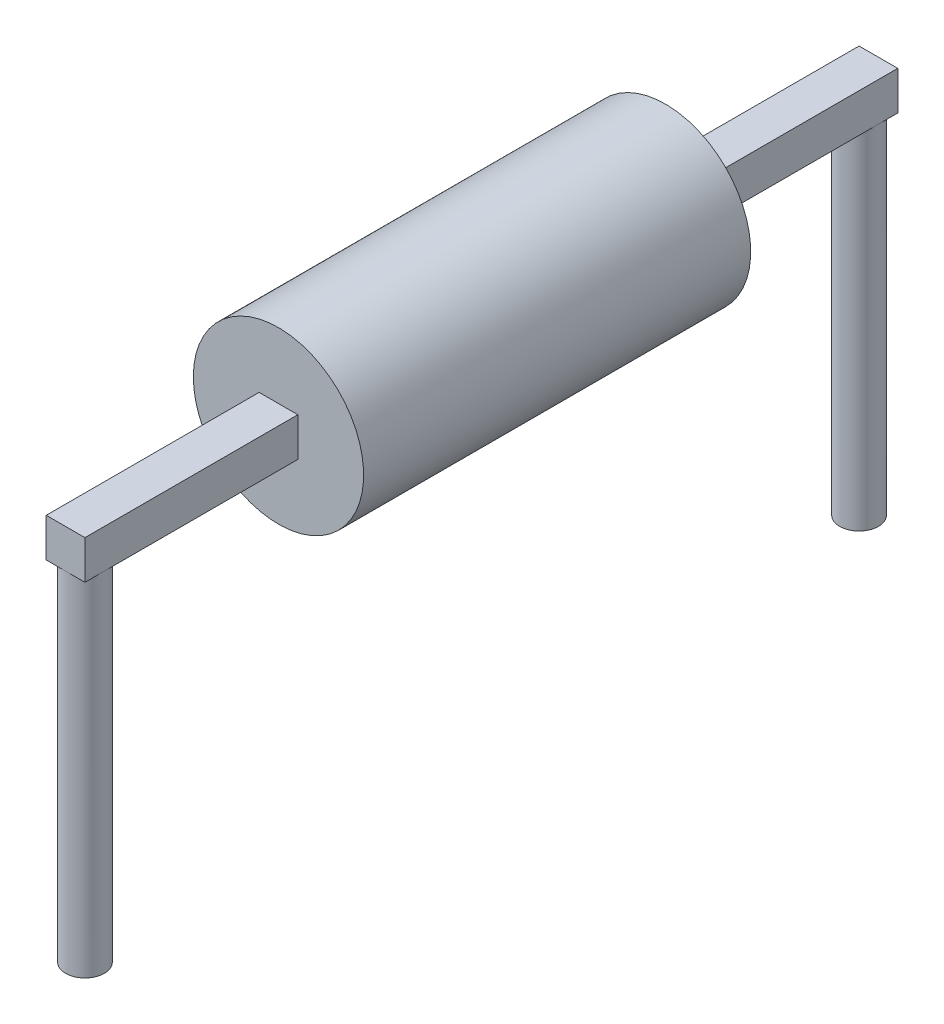
ISO-10303-21;
HEADER;
FILE_DESCRIPTION(('STEP AP214'),'2;1');
FILE_NAME('part.step','',(''),(''),'','','');
FILE_SCHEMA(('AUTOMOTIVE_DESIGN { 1 0 10303 214 1 1 1 1 }'));
ENDSEC;
DATA;
#1=APPLICATION_CONTEXT('core data for automotive mechanical design processes');
#2=APPLICATION_PROTOCOL_DEFINITION('international standard','automotive_design',2000,#1);
#3=PRODUCT_CONTEXT('',#1,'mechanical');
#4=PRODUCT('Part','Part','',(#3));
#5=PRODUCT_RELATED_PRODUCT_CATEGORY('part','',(#4));
#6=PRODUCT_DEFINITION_FORMATION('','',#4);
#7=PRODUCT_DEFINITION_CONTEXT('part definition',#1,'design');
#8=PRODUCT_DEFINITION('design','',#6,#7);
#9=PRODUCT_DEFINITION_SHAPE('','',#8);
#10=(LENGTH_UNIT() NAMED_UNIT(*) SI_UNIT(.MILLI.,.METRE.));
#11=(NAMED_UNIT(*) PLANE_ANGLE_UNIT() SI_UNIT($,.RADIAN.));
#12=(NAMED_UNIT(*) SI_UNIT($,.STERADIAN.) SOLID_ANGLE_UNIT());
#13=UNCERTAINTY_MEASURE_WITH_UNIT(LENGTH_MEASURE(1.E-05),#10,'distance_accuracy_value','');
#14=(GEOMETRIC_REPRESENTATION_CONTEXT(3) GLOBAL_UNCERTAINTY_ASSIGNED_CONTEXT((#13)) GLOBAL_UNIT_ASSIGNED_CONTEXT((#10,
#11,#12)) REPRESENTATION_CONTEXT('',''));
#15=CARTESIAN_POINT('',(0.,0.,0.));
#16=DIRECTION('',(0.,0.,1.));
#17=DIRECTION('',(1.,0.,0.));
#18=AXIS2_PLACEMENT_3D('',#15,#16,#17);
#19=CARTESIAN_POINT('',(-0.250117438522129,-0.25,7.74999999999998));
#20=DIRECTION('',(0.,1.,0.));
#21=DIRECTION('',(-0.999999999999999,0.,0.));
#22=AXIS2_PLACEMENT_3D('',#19,#20,#21);
#23=PLANE('',#22);
#24=CARTESIAN_POINT('',(0.,-0.25,-2.5));
#25=DIRECTION('',(0.,1.,0.));
#26=DIRECTION('',(-0.999999999999999,0.,0.));
#27=AXIS2_PLACEMENT_3D('',#24,#25,#26);
#28=CIRCLE('',#27,0.25);
#29=CARTESIAN_POINT('',(0.,-0.25,-2.75));
#30=VERTEX_POINT('',#29);
#31=CARTESIAN_POINT('',(0.249882561477871,-0.25,-2.50766194944277));
#32=VERTEX_POINT('',#31);
#33=EDGE_CURVE('E11',#30,#32,#28,.F.);
#34=ORIENTED_EDGE('',*,*,#33,.F.);
#35=DIRECTION('',(0.999999999999999,0.,0.));
#36=VECTOR('',#35,1.);
#37=CARTESIAN_POINT('',(-0.250117438522129,-0.25,-2.75));
#38=LINE('',#37,#36);
#39=CARTESIAN_POINT('',(0.249882561477871,-0.25,-2.75));
#40=VERTEX_POINT('',#39);
#41=EDGE_CURVE('E122',#30,#40,#38,.T.);
#42=ORIENTED_EDGE('',*,*,#41,.T.);
#43=DIRECTION('',(0.,0.,-0.999999999999999));
#44=VECTOR('',#43,1.);
#45=CARTESIAN_POINT('',(0.249882561477871,-0.25,7.74999999999998));
#46=LINE('',#45,#44);
#47=EDGE_CURVE('E32',#32,#40,#46,.T.);
#48=ORIENTED_EDGE('',*,*,#47,.F.);
#49=EDGE_LOOP('',(#34,#42,#48));
#50=FACE_BOUND('',#49,.T.);
#51=ADVANCED_FACE('F28',(#50),#23,.F.);
#52=CARTESIAN_POINT('',(0.,-0.25,-2.5));
#53=DIRECTION('',(0.,-1.,0.));
#54=DIRECTION('',(0.999999999999999,0.,0.));
#55=AXIS2_PLACEMENT_3D('',#52,#53,#54);
#56=CIRCLE('',#55,0.25);
#57=CARTESIAN_POINT('',(0.249882561477871,-0.25,-2.49233805055721));
#58=VERTEX_POINT('',#57);
#59=EDGE_CURVE('E52',#58,#30,#56,.T.);
#60=ORIENTED_EDGE('',*,*,#59,.F.);
#61=CARTESIAN_POINT('',(0.249882561477871,-0.25,0.));
#62=VERTEX_POINT('',#61);
#63=EDGE_CURVE('E218',#62,#58,#46,.T.);
#64=ORIENTED_EDGE('',*,*,#63,.F.);
#65=DIRECTION('',(-0.999999999999999,0.,0.));
#66=VECTOR('',#65,1.);
#67=CARTESIAN_POINT('',(0.,-0.25,0.));
#68=LINE('',#67,#66);
#69=CARTESIAN_POINT('',(-0.250117438522129,-0.25,0.));
#70=VERTEX_POINT('',#69);
#71=EDGE_CURVE('E230',#62,#70,#68,.T.);
#72=ORIENTED_EDGE('',*,*,#71,.T.);
#73=DIRECTION('',(0.,0.,-0.999999999999999));
#74=VECTOR('',#73,1.);
#75=CARTESIAN_POINT('',(-0.250117438522129,-0.25,7.74999999999998));
#76=LINE('',#75,#74);
#77=CARTESIAN_POINT('',(-0.250117438522129,-0.25,-2.75));
#78=VERTEX_POINT('',#77);
#79=EDGE_CURVE('E117',#70,#78,#76,.T.);
#80=ORIENTED_EDGE('',*,*,#79,.T.);
#81=EDGE_CURVE('E112',#78,#30,#38,.T.);
#82=ORIENTED_EDGE('',*,*,#81,.T.);
#83=EDGE_LOOP('',(#60,#64,#72,#80,#82));
#84=FACE_BOUND('',#83,.T.);
#85=ADVANCED_FACE('F114',(#84),#23,.F.);
#86=CARTESIAN_POINT('',(0.,-0.25,7.49999999999998));
#87=DIRECTION('',(0.,-1.,0.));
#88=DIRECTION('',(0.999999999999999,0.,0.));
#89=AXIS2_PLACEMENT_3D('',#86,#87,#88);
#90=CIRCLE('',#89,0.25);
#91=CARTESIAN_POINT('',(0.249882561477871,-0.25,7.50766194944277));
#92=VERTEX_POINT('',#91);
#93=CARTESIAN_POINT('',(0.,-0.25,7.74999999999998));
#94=VERTEX_POINT('',#93);
#95=EDGE_CURVE('E440',#92,#94,#90,.T.);
#96=ORIENTED_EDGE('',*,*,#95,.F.);
#97=CARTESIAN_POINT('',(0.249882561477871,-0.25,7.74999999999998));
#98=VERTEX_POINT('',#97);
#99=EDGE_CURVE('E211',#98,#92,#46,.T.);
#100=ORIENTED_EDGE('',*,*,#99,.F.);
#101=DIRECTION('',(0.999999999999999,0.,0.));
#102=VECTOR('',#101,1.);
#103=CARTESIAN_POINT('',(-0.250117438522129,-0.25,7.74999999999998));
#104=LINE('',#103,#102);
#105=EDGE_CURVE('E190',#94,#98,#104,.T.);
#106=ORIENTED_EDGE('',*,*,#105,.F.);
#107=EDGE_LOOP('',(#96,#100,#106));
#108=FACE_BOUND('',#107,.T.);
#109=ADVANCED_FACE('F290',(#108),#23,.F.);
#110=CARTESIAN_POINT('',(0.249882561477871,-0.25,7.49233805055721));
#111=VERTEX_POINT('',#110);
#112=EDGE_CURVE('E137',#94,#111,#90,.T.);
#113=ORIENTED_EDGE('',*,*,#112,.F.);
#114=CARTESIAN_POINT('',(-0.250117438522129,-0.25,7.74999999999998));
#115=VERTEX_POINT('',#114);
#116=EDGE_CURVE('E191',#115,#94,#104,.T.);
#117=ORIENTED_EDGE('',*,*,#116,.F.);
#118=CARTESIAN_POINT('',(-0.250117438522129,-0.25,5.));
#119=VERTEX_POINT('',#118);
#120=EDGE_CURVE('E206',#115,#119,#76,.T.);
#121=ORIENTED_EDGE('',*,*,#120,.T.);
#122=DIRECTION('',(-0.999999999999999,0.,0.));
#123=VECTOR('',#122,1.);
#124=CARTESIAN_POINT('',(0.,-0.25,5.));
#125=LINE('',#124,#123);
#126=CARTESIAN_POINT('',(0.249882561477871,-0.25,5.));
#127=VERTEX_POINT('',#126);
#128=EDGE_CURVE('E256',#127,#119,#125,.T.);
#129=ORIENTED_EDGE('',*,*,#128,.F.);
#130=EDGE_CURVE('E215',#111,#127,#46,.T.);
#131=ORIENTED_EDGE('',*,*,#130,.F.);
#132=EDGE_LOOP('',(#113,#117,#121,#129,#131));
#133=FACE_BOUND('',#132,.T.);
#134=ADVANCED_FACE('F257',(#133),#23,.F.);
#135=CARTESIAN_POINT('',(0.,0.,5.));
#136=DIRECTION('',(0.,0.,0.999999999999999));
#137=DIRECTION('',(0.999999999999999,0.,0.));
#138=AXIS2_PLACEMENT_3D('',#135,#136,#137);
#139=PLANE('',#138);
#140=CARTESIAN_POINT('',(0.,0.,5.));
#141=DIRECTION('',(0.,0.,0.999999999999999));
#142=DIRECTION('',(0.999999999999999,0.,0.));
#143=AXIS2_PLACEMENT_3D('',#140,#141,#142);
#144=CIRCLE('',#143,1.1);
#145=CARTESIAN_POINT('',(-1.1,0.,5.));
#146=VERTEX_POINT('',#145);
#147=EDGE_CURVE('E270',#146,#146,#144,.T.);
#148=ORIENTED_EDGE('',*,*,#147,.T.);
#149=EDGE_LOOP('',(#148));
#150=FACE_BOUND('',#149,.T.);
#151=ORIENTED_EDGE('',*,*,#128,.T.);
#152=DIRECTION('',(0.,1.,0.));
#153=VECTOR('',#152,1.);
#154=CARTESIAN_POINT('',(-0.250117438522129,0.,5.));
#155=LINE('',#154,#153);
#156=CARTESIAN_POINT('',(-0.250117438522129,0.249999999999999,5.));
#157=VERTEX_POINT('',#156);
#158=EDGE_CURVE('E261',#119,#157,#155,.T.);
#159=ORIENTED_EDGE('',*,*,#158,.T.);
#160=DIRECTION('',(0.999999999999999,0.,0.));
#161=VECTOR('',#160,1.);
#162=CARTESIAN_POINT('',(0.,0.250000000000001,5.));
#163=LINE('',#162,#161);
#164=CARTESIAN_POINT('',(0.249882561477871,0.250000000000001,5.));
#165=VERTEX_POINT('',#164);
#166=EDGE_CURVE('E238',#157,#165,#163,.T.);
#167=ORIENTED_EDGE('',*,*,#166,.T.);
#168=DIRECTION('',(0.,-1.,0.));
#169=VECTOR('',#168,1.);
#170=CARTESIAN_POINT('',(0.249882561477871,0.,5.));
#171=LINE('',#170,#169);
#172=EDGE_CURVE('E250',#165,#127,#171,.T.);
#173=ORIENTED_EDGE('',*,*,#172,.T.);
#174=EDGE_LOOP('',(#151,#159,#167,#173));
#175=FACE_BOUND('',#174,.T.);
#176=ADVANCED_FACE('F263',(#150,#175),#139,.T.);
#177=CARTESIAN_POINT('',(0.,0.,0.));
#178=DIRECTION('',(0.,0.,0.999999999999999));
#179=DIRECTION('',(0.999999999999999,0.,0.));
#180=AXIS2_PLACEMENT_3D('',#177,#178,#179);
#181=PLANE('',#180);
#182=CARTESIAN_POINT('',(0.,0.,0.));
#183=DIRECTION('',(0.,0.,0.999999999999999));
#184=DIRECTION('',(0.999999999999999,0.,0.));
#185=AXIS2_PLACEMENT_3D('',#182,#183,#184);
#186=CIRCLE('',#185,1.1);
#187=CARTESIAN_POINT('',(-1.1,0.,0.));
#188=VERTEX_POINT('',#187);
#189=EDGE_CURVE('E267',#188,#188,#186,.T.);
#190=ORIENTED_EDGE('',*,*,#189,.F.);
#191=EDGE_LOOP('',(#190));
#192=FACE_BOUND('',#191,.T.);
#193=DIRECTION('',(0.,1.,0.));
#194=VECTOR('',#193,1.);
#195=CARTESIAN_POINT('',(-0.250117438522129,0.,0.));
#196=LINE('',#195,#194);
#197=CARTESIAN_POINT('',(-0.250117438522129,0.250000000000001,0.));
#198=VERTEX_POINT('',#197);
#199=EDGE_CURVE('E38',#70,#198,#196,.T.);
#200=ORIENTED_EDGE('',*,*,#199,.F.);
#201=ORIENTED_EDGE('',*,*,#71,.F.);
#202=DIRECTION('',(0.,-1.,0.));
#203=VECTOR('',#202,1.);
#204=CARTESIAN_POINT('',(0.249882561477871,0.,0.));
#205=LINE('',#204,#203);
#206=CARTESIAN_POINT('',(0.249882561477871,0.250000000000001,0.));
#207=VERTEX_POINT('',#206);
#208=EDGE_CURVE('E229',#207,#62,#205,.T.);
#209=ORIENTED_EDGE('',*,*,#208,.F.);
#210=DIRECTION('',(0.999999999999999,0.,0.));
#211=VECTOR('',#210,1.);
#212=CARTESIAN_POINT('',(0.,0.250000000000001,0.));
#213=LINE('',#212,#211);
#214=EDGE_CURVE('E273',#198,#207,#213,.T.);
#215=ORIENTED_EDGE('',*,*,#214,.F.);
#216=EDGE_LOOP('',(#200,#201,#209,#215));
#217=FACE_BOUND('',#216,.T.);
#218=ADVANCED_FACE('F298',(#192,#217),#181,.F.);
#219=CARTESIAN_POINT('',(0.,0.,5.));
#220=DIRECTION('',(0.,0.,-0.999999999999999));
#221=DIRECTION('',(-0.999999999999999,0.,0.));
#222=AXIS2_PLACEMENT_3D('',#219,#220,#221);
#223=CYLINDRICAL_SURFACE('',#222,1.1);
#224=CARTESIAN_POINT('',(-1.1,0.,5.));
#225=CARTESIAN_POINT('',(-1.1,0.,4.94791666666667));
#226=CARTESIAN_POINT('',(-1.1,0.,4.89583333333334));
#227=CARTESIAN_POINT('',(-1.1,0.,4.79166666666667));
#228=CARTESIAN_POINT('',(-1.1,0.,4.73958333333334));
#229=CARTESIAN_POINT('',(-1.1,0.,4.63541666666667));
#230=CARTESIAN_POINT('',(-1.1,0.,4.58333333333334));
#231=CARTESIAN_POINT('',(-1.1,0.,4.47916666666667));
#232=CARTESIAN_POINT('',(-1.1,0.,4.42708333333334));
#233=CARTESIAN_POINT('',(-1.1,0.,4.32291666666667));
#234=CARTESIAN_POINT('',(-1.1,0.,4.27083333333334));
#235=CARTESIAN_POINT('',(-1.1,0.,4.16666666666667));
#236=CARTESIAN_POINT('',(-1.1,0.,4.11458333333334));
#237=CARTESIAN_POINT('',(-1.1,0.,4.01041666666667));
#238=CARTESIAN_POINT('',(-1.1,0.,3.95833333333334));
#239=CARTESIAN_POINT('',(-1.1,0.,3.85416666666667));
#240=CARTESIAN_POINT('',(-1.1,0.,3.80208333333334));
#241=CARTESIAN_POINT('',(-1.1,0.,3.69791666666667));
#242=CARTESIAN_POINT('',(-1.1,0.,3.64583333333334));
#243=CARTESIAN_POINT('',(-1.1,0.,3.54166666666667));
#244=CARTESIAN_POINT('',(-1.1,0.,3.48958333333334));
#245=CARTESIAN_POINT('',(-1.1,0.,3.38541666666667));
#246=CARTESIAN_POINT('',(-1.1,0.,3.33333333333334));
#247=CARTESIAN_POINT('',(-1.1,0.,3.22916666666667));
#248=CARTESIAN_POINT('',(-1.1,0.,3.17708333333334));
#249=CARTESIAN_POINT('',(-1.1,0.,3.07291666666667));
#250=CARTESIAN_POINT('',(-1.1,0.,3.02083333333334));
#251=CARTESIAN_POINT('',(-1.1,0.,2.91666666666667));
#252=CARTESIAN_POINT('',(-1.1,0.,2.86458333333334));
#253=CARTESIAN_POINT('',(-1.1,0.,2.76041666666667));
#254=CARTESIAN_POINT('',(-1.1,0.,2.70833333333334));
#255=CARTESIAN_POINT('',(-1.1,0.,2.60416666666667));
#256=CARTESIAN_POINT('',(-1.1,0.,2.55208333333333));
#257=CARTESIAN_POINT('',(-1.1,0.,2.44791666666667));
#258=CARTESIAN_POINT('',(-1.1,0.,2.39583333333334));
#259=CARTESIAN_POINT('',(-1.1,0.,2.29166666666667));
#260=CARTESIAN_POINT('',(-1.1,0.,2.23958333333334));
#261=CARTESIAN_POINT('',(-1.1,0.,2.13541666666667));
#262=CARTESIAN_POINT('',(-1.1,0.,2.08333333333334));
#263=CARTESIAN_POINT('',(-1.1,0.,1.97916666666667));
#264=CARTESIAN_POINT('',(-1.1,0.,1.92708333333333));
#265=CARTESIAN_POINT('',(-1.1,0.,1.82291666666667));
#266=CARTESIAN_POINT('',(-1.1,0.,1.77083333333333));
#267=CARTESIAN_POINT('',(-1.1,0.,1.66666666666667));
#268=CARTESIAN_POINT('',(-1.1,0.,1.61458333333333));
#269=CARTESIAN_POINT('',(-1.1,0.,1.51041666666667));
#270=CARTESIAN_POINT('',(-1.1,0.,1.45833333333333));
#271=CARTESIAN_POINT('',(-1.1,0.,1.35416666666667));
#272=CARTESIAN_POINT('',(-1.1,0.,1.30208333333333));
#273=CARTESIAN_POINT('',(-1.1,0.,1.19791666666667));
#274=CARTESIAN_POINT('',(-1.1,0.,1.14583333333333));
#275=CARTESIAN_POINT('',(-1.1,0.,1.04166666666667));
#276=CARTESIAN_POINT('',(-1.1,0.,0.989583333333334));
#277=CARTESIAN_POINT('',(-1.1,0.,0.885416666666668));
#278=CARTESIAN_POINT('',(-1.1,0.,0.833333333333334));
#279=CARTESIAN_POINT('',(-1.1,0.,0.729166666666668));
#280=CARTESIAN_POINT('',(-1.1,0.,0.677083333333335));
#281=CARTESIAN_POINT('',(-1.1,0.,0.572916666666668));
#282=CARTESIAN_POINT('',(-1.1,0.,0.520833333333335));
#283=CARTESIAN_POINT('',(-1.1,0.,0.416666666666668));
#284=CARTESIAN_POINT('',(-1.1,0.,0.364583333333334));
#285=CARTESIAN_POINT('',(-1.1,0.,0.260416666666667));
#286=CARTESIAN_POINT('',(-1.1,0.,0.208333333333334));
#287=CARTESIAN_POINT('',(-1.1,0.,0.104166666666667));
#288=CARTESIAN_POINT('',(-1.1,0.,0.0520833333333333));
#289=CARTESIAN_POINT('',(-1.1,0.,0.));
#290=B_SPLINE_CURVE_WITH_KNOTS('',3,(#224,#225,#226,#227,#228,#229,#230,#231,#232,#233,#234,
#235,#236,#237,#238,#239,#240,#241,#242,#243,#244,#245,#246,#247,#248,#249,#250,#251,#252,#253,
#254,#255,#256,#257,#258,#259,#260,#261,#262,#263,#264,#265,#266,#267,#268,#269,#270,#271,#272,
#273,#274,#275,#276,#277,#278,#279,#280,#281,#282,#283,#284,#285,#286,#287,#288,#289),
.UNSPECIFIED.,.F.,.F.,(4,2,2,2,2,2,2,2,2,2,2,2,2,2,2,2,2,2,2,2,2,2,2,2,2,2,2,2,2,2,2,2,4),(0.,
0.15625,0.3125,0.46875,0.625000000000001,0.781250000000001,0.937500000000001,1.09375,1.25,
1.40625,1.5625,1.71875,1.875,2.03125,2.1875,2.34375,2.5,2.65625,2.8125,2.96875,3.125,3.28125,
3.4375,3.59375,3.75,3.90625,4.0625,4.21875,4.375,4.53125,4.6875,4.84375,5.),.UNSPECIFIED.);
#291=EDGE_CURVE('BSEAM30',#146,#188,#290,.T.);
#292=ORIENTED_EDGE('',*,*,#147,.F.);
#293=ORIENTED_EDGE('',*,*,#189,.T.);
#294=ORIENTED_EDGE('',*,*,#291,.T.);
#295=ORIENTED_EDGE('',*,*,#291,.F.);
#296=EDGE_LOOP('',(#292,#294,#293,#295));
#297=FACE_BOUND('',#296,.T.);
#298=ADVANCED_FACE('F30',(#297),#223,.T.);
#299=CARTESIAN_POINT('',(-0.250117438522129,-0.25,-2.75));
#300=DIRECTION('',(0.,0.,-0.999999999999999));
#301=DIRECTION('',(-0.999999999999999,0.,0.));
#302=AXIS2_PLACEMENT_3D('',#299,#300,#301);
#303=PLANE('',#302);
#304=DIRECTION('',(0.,-1.,0.));
#305=VECTOR('',#304,1.);
#306=CARTESIAN_POINT('',(-0.250117438522129,-0.25,-2.75));
#307=LINE('',#306,#305);
#308=CARTESIAN_POINT('',(-0.250117438522129,0.249999999999999,-2.75));
#309=VERTEX_POINT('',#308);
#310=EDGE_CURVE('E128',#309,#78,#307,.T.);
#311=ORIENTED_EDGE('',*,*,#310,.F.);
#312=DIRECTION('',(-0.999999999999999,0.,0.));
#313=VECTOR('',#312,1.);
#314=CARTESIAN_POINT('',(-0.250117438522129,0.249999999999999,-2.75));
#315=LINE('',#314,#313);
#316=CARTESIAN_POINT('',(0.249882561477871,0.249999999999999,-2.75));
#317=VERTEX_POINT('',#316);
#318=EDGE_CURVE('E184',#317,#309,#315,.T.);
#319=ORIENTED_EDGE('',*,*,#318,.F.);
#320=DIRECTION('',(0.,1.,0.));
#321=VECTOR('',#320,1.);
#322=CARTESIAN_POINT('',(0.249882561477871,-0.25,-2.75));
#323=LINE('',#322,#321);
#324=EDGE_CURVE('E121',#40,#317,#323,.T.);
#325=ORIENTED_EDGE('',*,*,#324,.F.);
#326=ORIENTED_EDGE('',*,*,#41,.F.);
#327=ORIENTED_EDGE('',*,*,#81,.F.);
#328=EDGE_LOOP('',(#311,#319,#325,#326,#327));
#329=FACE_BOUND('',#328,.T.);
#330=ADVANCED_FACE('F125',(#329),#303,.T.);
#331=CARTESIAN_POINT('',(-0.250117438522129,0.250000000000001,7.74999999999998));
#332=DIRECTION('',(0.,-1.,0.));
#333=DIRECTION('',(0.,0.,-0.999999999999999));
#334=AXIS2_PLACEMENT_3D('',#331,#332,#333);
#335=PLANE('',#334);
#336=DIRECTION('',(0.,0.,-0.999999999999999));
#337=VECTOR('',#336,1.);
#338=CARTESIAN_POINT('',(-0.250117438522129,0.250000000000001,7.74999999999998));
#339=LINE('',#338,#337);
#340=EDGE_CURVE('E198',#198,#309,#339,.T.);
#341=ORIENTED_EDGE('',*,*,#340,.F.);
#342=ORIENTED_EDGE('',*,*,#214,.T.);
#343=DIRECTION('',(0.,0.,-0.999999999999999));
#344=VECTOR('',#343,1.);
#345=CARTESIAN_POINT('',(0.249882561477871,0.250000000000001,7.74999999999998));
#346=LINE('',#345,#344);
#347=EDGE_CURVE('E202',#207,#317,#346,.T.);
#348=ORIENTED_EDGE('',*,*,#347,.T.);
#349=ORIENTED_EDGE('',*,*,#318,.T.);
#350=EDGE_LOOP('',(#341,#342,#348,#349));
#351=FACE_BOUND('',#350,.T.);
#352=ADVANCED_FACE('F348',(#351),#335,.F.);
#353=CARTESIAN_POINT('',(0.249882561477871,-0.25,7.74999999999998));
#354=DIRECTION('',(-0.999999999999999,0.,0.));
#355=DIRECTION('',(0.,0.,0.999999999999999));
#356=AXIS2_PLACEMENT_3D('',#353,#354,#355);
#357=PLANE('',#356);
#358=ORIENTED_EDGE('',*,*,#347,.F.);
#359=ORIENTED_EDGE('',*,*,#208,.T.);
#360=ORIENTED_EDGE('',*,*,#63,.T.);
#361=CARTESIAN_POINT('',(0.249882561477871,-0.25,-2.49233805055722));
#362=DIRECTION('',(0.,0.,-1.));
#363=VECTOR('',#362,1.);
#364=LINE('',#361,#363);
#365=EDGE_CURVE('E132',#58,#32,#364,.T.);
#366=ORIENTED_EDGE('',*,*,#365,.T.);
#367=ORIENTED_EDGE('',*,*,#47,.T.);
#368=ORIENTED_EDGE('',*,*,#324,.T.);
#369=EDGE_LOOP('',(#358,#359,#360,#366,#367,#368));
#370=FACE_BOUND('',#369,.T.);
#371=ADVANCED_FACE('F227',(#370),#357,.F.);
#372=CARTESIAN_POINT('',(-0.250117438522129,-0.25,7.74999999999998));
#373=DIRECTION('',(0.999999999999999,0.,0.));
#374=DIRECTION('',(0.,1.,0.));
#375=AXIS2_PLACEMENT_3D('',#372,#373,#374);
#376=PLANE('',#375);
#377=ORIENTED_EDGE('',*,*,#79,.F.);
#378=ORIENTED_EDGE('',*,*,#199,.T.);
#379=ORIENTED_EDGE('',*,*,#340,.T.);
#380=ORIENTED_EDGE('',*,*,#310,.T.);
#381=EDGE_LOOP('',(#377,#378,#379,#380));
#382=FACE_BOUND('',#381,.T.);
#383=ADVANCED_FACE('F235',(#382),#376,.F.);
#384=ORIENTED_EDGE('',*,*,#158,.F.);
#385=ORIENTED_EDGE('',*,*,#120,.F.);
#386=DIRECTION('',(0.,-1.,0.));
#387=VECTOR('',#386,1.);
#388=CARTESIAN_POINT('',(-0.250117438522129,-0.25,7.74999999999998));
#389=LINE('',#388,#387);
#390=CARTESIAN_POINT('',(-0.250117438522129,0.250000000000001,7.74999999999998));
#391=VERTEX_POINT('',#390);
#392=EDGE_CURVE('E187',#391,#115,#389,.T.);
#393=ORIENTED_EDGE('',*,*,#392,.F.);
#394=EDGE_CURVE('E199',#391,#157,#339,.T.);
#395=ORIENTED_EDGE('',*,*,#394,.T.);
#396=EDGE_LOOP('',(#384,#385,#393,#395));
#397=FACE_BOUND('',#396,.T.);
#398=ADVANCED_FACE('F289',(#397),#376,.F.);
#399=ORIENTED_EDGE('',*,*,#172,.F.);
#400=CARTESIAN_POINT('',(0.249882561477871,0.250000000000001,7.74999999999998));
#401=VERTEX_POINT('',#400);
#402=EDGE_CURVE('E203',#401,#165,#346,.T.);
#403=ORIENTED_EDGE('',*,*,#402,.F.);
#404=DIRECTION('',(0.,1.,0.));
#405=VECTOR('',#404,1.);
#406=CARTESIAN_POINT('',(0.249882561477871,-0.25,7.74999999999998));
#407=LINE('',#406,#405);
#408=EDGE_CURVE('E194',#98,#401,#407,.T.);
#409=ORIENTED_EDGE('',*,*,#408,.F.);
#410=ORIENTED_EDGE('',*,*,#99,.T.);
#411=CARTESIAN_POINT('',(0.,-0.25,7.49999999999998));
#412=DIRECTION('',(0.,-1.,0.));
#413=DIRECTION('',(0.999530245911438,0.,-0.0306477977711425));
#414=AXIS2_PLACEMENT_3D('',#411,#412,#413);
#415=CIRCLE('',#414,0.25);
#416=EDGE_CURVE('E181',#111,#92,#415,.T.);
#417=ORIENTED_EDGE('',*,*,#416,.F.);
#418=ORIENTED_EDGE('',*,*,#130,.T.);
#419=EDGE_LOOP('',(#399,#403,#409,#410,#417,#418));
#420=FACE_BOUND('',#419,.T.);
#421=ADVANCED_FACE('F247',(#420),#357,.F.);
#422=ORIENTED_EDGE('',*,*,#166,.F.);
#423=ORIENTED_EDGE('',*,*,#394,.F.);
#424=DIRECTION('',(-0.999999999999999,0.,0.));
#425=VECTOR('',#424,1.);
#426=CARTESIAN_POINT('',(-0.250117438522129,0.250000000000001,7.74999999999998));
#427=LINE('',#426,#425);
#428=EDGE_CURVE('E196',#401,#391,#427,.T.);
#429=ORIENTED_EDGE('',*,*,#428,.F.);
#430=ORIENTED_EDGE('',*,*,#402,.T.);
#431=EDGE_LOOP('',(#422,#423,#429,#430));
#432=FACE_BOUND('',#431,.T.);
#433=ADVANCED_FACE('F288',(#432),#335,.F.);
#434=CARTESIAN_POINT('',(-0.250117438522129,-0.25,7.74999999999998));
#435=DIRECTION('',(0.,0.,-0.999999999999999));
#436=DIRECTION('',(-0.999999999999999,0.,0.));
#437=AXIS2_PLACEMENT_3D('',#434,#435,#436);
#438=PLANE('',#437);
#439=ORIENTED_EDGE('',*,*,#392,.T.);
#440=ORIENTED_EDGE('',*,*,#116,.T.);
#441=ORIENTED_EDGE('',*,*,#105,.T.);
#442=ORIENTED_EDGE('',*,*,#408,.T.);
#443=ORIENTED_EDGE('',*,*,#428,.T.);
#444=EDGE_LOOP('',(#439,#440,#441,#442,#443));
#445=FACE_BOUND('',#444,.T.);
#446=ADVANCED_FACE('F167',(#445),#438,.F.);
#447=CARTESIAN_POINT('',(0.,-4.75,7.49999999999998));
#448=DIRECTION('',(0.,1.,0.));
#449=DIRECTION('',(-0.999999999999999,0.,0.));
#450=AXIS2_PLACEMENT_3D('',#447,#448,#449);
#451=CYLINDRICAL_SURFACE('',#450,0.25);
#452=CARTESIAN_POINT('',(0.,-4.75,7.49999999999998));
#453=DIRECTION('',(0.,-1.,0.));
#454=DIRECTION('',(0.999999999999999,0.,0.));
#455=AXIS2_PLACEMENT_3D('',#452,#453,#454);
#456=CIRCLE('',#455,0.25);
#457=CARTESIAN_POINT('',(0.25,-4.75,7.49999999999998));
#458=VERTEX_POINT('',#457);
#459=EDGE_CURVE('E442',#458,#458,#456,.T.);
#460=ORIENTED_EDGE('',*,*,#459,.F.);
#461=EDGE_LOOP('',(#460));
#462=FACE_BOUND('',#461,.T.);
#463=ORIENTED_EDGE('',*,*,#95,.T.);
#464=ORIENTED_EDGE('',*,*,#112,.T.);
#465=ORIENTED_EDGE('',*,*,#416,.T.);
#466=EDGE_LOOP('',(#463,#464,#465));
#467=FACE_BOUND('',#466,.T.);
#468=ADVANCED_FACE('F162',(#462,#467),#451,.T.);
#469=CARTESIAN_POINT('',(0.,-4.75,7.49999999999998));
#470=DIRECTION('',(0.,-1.,0.));
#471=DIRECTION('',(0.999999999999999,0.,0.));
#472=AXIS2_PLACEMENT_3D('',#469,#470,#471);
#473=PLANE('',#472);
#474=ORIENTED_EDGE('',*,*,#459,.T.);
#475=EDGE_LOOP('',(#474));
#476=FACE_BOUND('',#475,.T.);
#477=ADVANCED_FACE('F158',(#476),#473,.T.);
#478=CARTESIAN_POINT('',(0.,-4.75,-2.5));
#479=DIRECTION('',(0.,1.,0.));
#480=DIRECTION('',(-0.999999999999999,0.,0.));
#481=AXIS2_PLACEMENT_3D('',#478,#479,#480);
#482=CYLINDRICAL_SURFACE('',#481,0.25);
#483=CARTESIAN_POINT('',(0.,-4.75,-2.5));
#484=DIRECTION('',(0.,-1.,0.));
#485=DIRECTION('',(0.999999999999999,0.,0.));
#486=AXIS2_PLACEMENT_3D('',#483,#484,#485);
#487=CIRCLE('',#486,0.25);
#488=CARTESIAN_POINT('',(0.25,-4.75,-2.5));
#489=VERTEX_POINT('',#488);
#490=EDGE_CURVE('E134',#489,#489,#487,.T.);
#491=ORIENTED_EDGE('',*,*,#490,.F.);
#492=EDGE_LOOP('',(#491));
#493=FACE_BOUND('',#492,.T.);
#494=ORIENTED_EDGE('',*,*,#59,.T.);
#495=ORIENTED_EDGE('',*,*,#33,.T.);
#496=ORIENTED_EDGE('',*,*,#365,.F.);
#497=EDGE_LOOP('',(#494,#495,#496));
#498=FACE_BOUND('',#497,.T.);
#499=ADVANCED_FACE('F131',(#493,#498),#482,.T.);
#500=CARTESIAN_POINT('',(0.,-4.75,-2.5));
#501=DIRECTION('',(0.,-1.,0.));
#502=DIRECTION('',(0.999999999999999,0.,0.));
#503=AXIS2_PLACEMENT_3D('',#500,#501,#502);
#504=PLANE('',#503);
#505=ORIENTED_EDGE('',*,*,#490,.T.);
#506=EDGE_LOOP('',(#505));
#507=FACE_BOUND('',#506,.T.);
#508=ADVANCED_FACE('F157',(#507),#504,.T.);
#509=CLOSED_SHELL('',(#51,#85,#109,#134,#176,#218,#298,#330,#352,#371,#383,#398,#421,#433,#446,
#468,#477,#499,#508));
#510=MANIFOLD_SOLID_BREP('B2',#509);
#511=ADVANCED_BREP_SHAPE_REPRESENTATION('',(#18,#510),#14);
#512=SHAPE_DEFINITION_REPRESENTATION(#9,#511);
ENDSEC;
END-ISO-10303-21;
